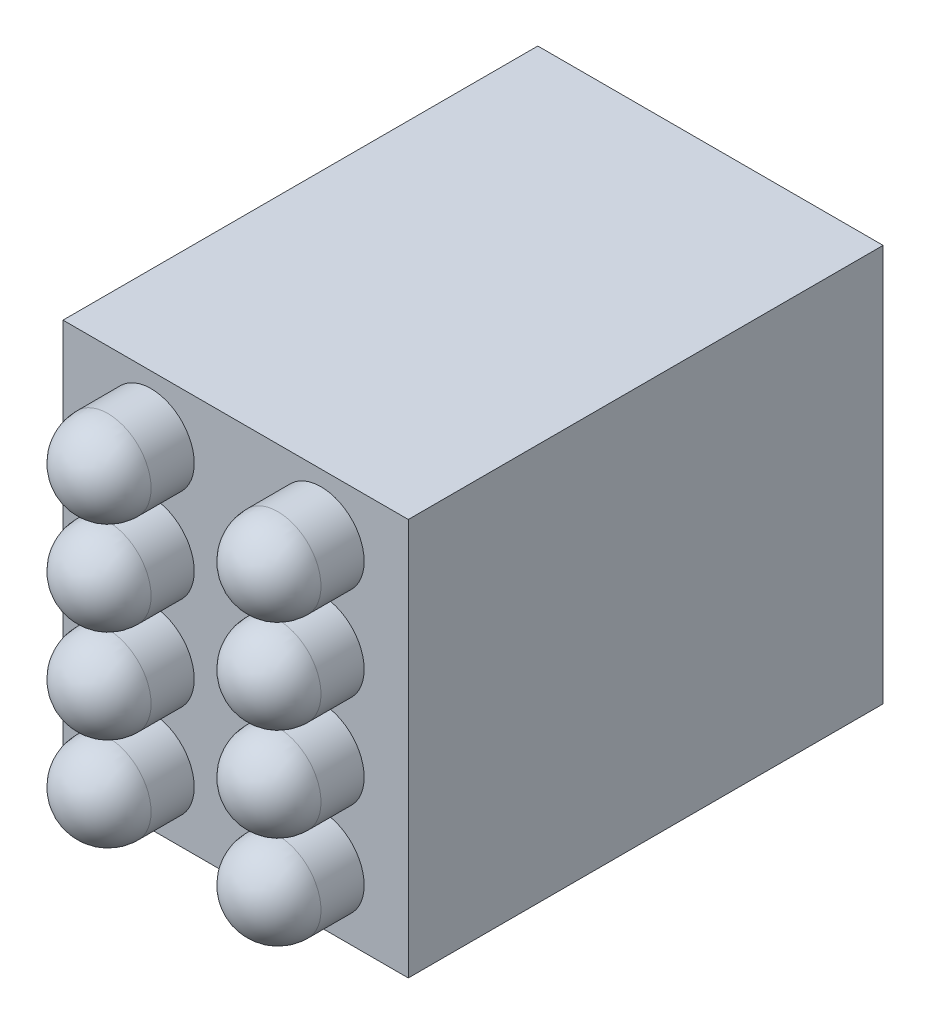
ISO-10303-21;
HEADER;
FILE_DESCRIPTION(('STEP AP214'),'2;1');
FILE_NAME('part.step','',(''),(''),'','','');
FILE_SCHEMA(('AUTOMOTIVE_DESIGN { 1 0 10303 214 1 1 1 1 }'));
ENDSEC;
DATA;
#1=APPLICATION_CONTEXT('core data for automotive mechanical design processes');
#2=APPLICATION_PROTOCOL_DEFINITION('international standard','automotive_design',2000,#1);
#3=PRODUCT_CONTEXT('',#1,'mechanical');
#4=PRODUCT('Part','Part','',(#3));
#5=PRODUCT_RELATED_PRODUCT_CATEGORY('part','',(#4));
#6=PRODUCT_DEFINITION_FORMATION('','',#4);
#7=PRODUCT_DEFINITION_CONTEXT('part definition',#1,'design');
#8=PRODUCT_DEFINITION('design','',#6,#7);
#9=PRODUCT_DEFINITION_SHAPE('','',#8);
#10=(LENGTH_UNIT() NAMED_UNIT(*) SI_UNIT(.MILLI.,.METRE.));
#11=(NAMED_UNIT(*) PLANE_ANGLE_UNIT() SI_UNIT($,.RADIAN.));
#12=(NAMED_UNIT(*) SI_UNIT($,.STERADIAN.) SOLID_ANGLE_UNIT());
#13=UNCERTAINTY_MEASURE_WITH_UNIT(LENGTH_MEASURE(1.E-05),#10,'distance_accuracy_value','');
#14=(GEOMETRIC_REPRESENTATION_CONTEXT(3) GLOBAL_UNCERTAINTY_ASSIGNED_CONTEXT((#13)) GLOBAL_UNIT_ASSIGNED_CONTEXT((#10,
#11,#12)) REPRESENTATION_CONTEXT('',''));
#15=CARTESIAN_POINT('',(0.,0.,0.));
#16=DIRECTION('',(0.,0.,1.));
#17=DIRECTION('',(1.,0.,0.));
#18=AXIS2_PLACEMENT_3D('',#15,#16,#17);
#19=CARTESIAN_POINT('',(2.51079999999999,4.1225,8.255));
#20=DIRECTION('',(1.,0.,0.));
#21=DIRECTION('',(0.,1.,0.));
#22=AXIS2_PLACEMENT_3D('',#19,#20,#21);
#23=SPHERICAL_SURFACE('',#22,1.27);
#24=CARTESIAN_POINT('',(2.51079999999999,4.1225,8.255));
#25=DIRECTION('',(0.,0.,1.));
#26=DIRECTION('',(1.,0.,0.));
#27=AXIS2_PLACEMENT_3D('',#24,#25,#26);
#28=CIRCLE('',#27,1.27);
#29=CARTESIAN_POINT('',(1.24079999999999,4.12249999999999,8.255));
#30=VERTEX_POINT('',#29);
#31=CARTESIAN_POINT('',(3.78079999999999,4.12249999999999,8.255));
#32=VERTEX_POINT('',#31);
#33=EDGE_CURVE('E109',#30,#32,#28,.F.);
#34=ORIENTED_EDGE('',*,*,#33,.F.);
#35=CARTESIAN_POINT('',(2.51079999999999,4.1225,8.255));
#36=DIRECTION('',(0.,0.,1.));
#37=DIRECTION('',(1.,0.,0.));
#38=AXIS2_PLACEMENT_3D('',#35,#36,#37);
#39=CIRCLE('',#38,1.27);
#40=EDGE_CURVE('E104',#32,#30,#39,.F.);
#41=ORIENTED_EDGE('',*,*,#40,.F.);
#42=EDGE_LOOP('',(#34,#41));
#43=FACE_BOUND('',#42,.T.);
#44=ADVANCED_FACE('F17',(#43),#23,.T.);
#45=CARTESIAN_POINT('',(2.51079999999999,1.3725,8.255));
#46=DIRECTION('',(1.,0.,0.));
#47=DIRECTION('',(0.,1.,0.));
#48=AXIS2_PLACEMENT_3D('',#45,#46,#47);
#49=SPHERICAL_SURFACE('',#48,1.27);
#50=CARTESIAN_POINT('',(2.51079999999999,1.3725,8.255));
#51=DIRECTION('',(0.,0.,1.));
#52=DIRECTION('',(1.,0.,0.));
#53=AXIS2_PLACEMENT_3D('',#50,#51,#52);
#54=CIRCLE('',#53,1.27);
#55=CARTESIAN_POINT('',(1.24079999999999,1.3725,8.255));
#56=VERTEX_POINT('',#55);
#57=CARTESIAN_POINT('',(3.78079999999999,1.3725,8.255));
#58=VERTEX_POINT('',#57);
#59=EDGE_CURVE('E113',#56,#58,#54,.F.);
#60=ORIENTED_EDGE('',*,*,#59,.F.);
#61=CARTESIAN_POINT('',(2.51079999999999,1.3725,8.255));
#62=DIRECTION('',(0.,0.,1.));
#63=DIRECTION('',(1.,0.,0.));
#64=AXIS2_PLACEMENT_3D('',#61,#62,#63);
#65=CIRCLE('',#64,1.27);
#66=EDGE_CURVE('E111',#58,#56,#65,.F.);
#67=ORIENTED_EDGE('',*,*,#66,.F.);
#68=EDGE_LOOP('',(#60,#67));
#69=FACE_BOUND('',#68,.T.);
#70=ADVANCED_FACE('F245',(#69),#49,.T.);
#71=CARTESIAN_POINT('',(2.51079999999999,-1.3775,8.255));
#72=DIRECTION('',(1.,0.,0.));
#73=DIRECTION('',(0.,1.,0.));
#74=AXIS2_PLACEMENT_3D('',#71,#72,#73);
#75=SPHERICAL_SURFACE('',#74,1.27);
#76=CARTESIAN_POINT('',(2.51079999999999,-1.3775,8.255));
#77=DIRECTION('',(0.,0.,1.));
#78=DIRECTION('',(1.,0.,0.));
#79=AXIS2_PLACEMENT_3D('',#76,#77,#78);
#80=CIRCLE('',#79,1.27);
#81=CARTESIAN_POINT('',(1.24079999999999,-1.3775,8.255));
#82=VERTEX_POINT('',#81);
#83=CARTESIAN_POINT('',(3.78079999999999,-1.3775,8.255));
#84=VERTEX_POINT('',#83);
#85=EDGE_CURVE('E230',#82,#84,#80,.F.);
#86=ORIENTED_EDGE('',*,*,#85,.F.);
#87=CARTESIAN_POINT('',(2.51079999999999,-1.3775,8.255));
#88=DIRECTION('',(0.,0.,1.));
#89=DIRECTION('',(1.,0.,0.));
#90=AXIS2_PLACEMENT_3D('',#87,#88,#89);
#91=CIRCLE('',#90,1.27);
#92=EDGE_CURVE('E228',#84,#82,#91,.F.);
#93=ORIENTED_EDGE('',*,*,#92,.F.);
#94=EDGE_LOOP('',(#86,#93));
#95=FACE_BOUND('',#94,.T.);
#96=ADVANCED_FACE('F220',(#95),#75,.T.);
#97=CARTESIAN_POINT('',(2.51079999999999,-4.1275,8.255));
#98=DIRECTION('',(1.,0.,0.));
#99=DIRECTION('',(0.,1.,0.));
#100=AXIS2_PLACEMENT_3D('',#97,#98,#99);
#101=SPHERICAL_SURFACE('',#100,1.27);
#102=CARTESIAN_POINT('',(2.51079999999999,-4.1275,8.255));
#103=DIRECTION('',(0.,0.,1.));
#104=DIRECTION('',(1.,0.,0.));
#105=AXIS2_PLACEMENT_3D('',#102,#103,#104);
#106=CIRCLE('',#105,1.27);
#107=CARTESIAN_POINT('',(1.24079999999999,-4.1275,8.255));
#108=VERTEX_POINT('',#107);
#109=CARTESIAN_POINT('',(3.78079999999999,-4.1275,8.255));
#110=VERTEX_POINT('',#109);
#111=EDGE_CURVE('E201',#108,#110,#106,.F.);
#112=ORIENTED_EDGE('',*,*,#111,.F.);
#113=CARTESIAN_POINT('',(2.51079999999999,-4.1275,8.255));
#114=DIRECTION('',(0.,0.,1.));
#115=DIRECTION('',(1.,0.,0.));
#116=AXIS2_PLACEMENT_3D('',#113,#114,#115);
#117=CIRCLE('',#116,1.27);
#118=EDGE_CURVE('E210',#110,#108,#117,.F.);
#119=ORIENTED_EDGE('',*,*,#118,.F.);
#120=EDGE_LOOP('',(#112,#119));
#121=FACE_BOUND('',#120,.T.);
#122=ADVANCED_FACE('F215',(#121),#101,.T.);
#123=CARTESIAN_POINT('',(-2.4892,4.1225,8.255));
#124=DIRECTION('',(1.,0.,0.));
#125=DIRECTION('',(0.,1.,0.));
#126=AXIS2_PLACEMENT_3D('',#123,#124,#125);
#127=SPHERICAL_SURFACE('',#126,1.27);
#128=CARTESIAN_POINT('',(-2.4892,4.1225,8.255));
#129=DIRECTION('',(0.,0.,1.));
#130=DIRECTION('',(1.,0.,0.));
#131=AXIS2_PLACEMENT_3D('',#128,#129,#130);
#132=CIRCLE('',#131,1.27);
#133=CARTESIAN_POINT('',(-3.7592,4.12249999999999,8.255));
#134=VERTEX_POINT('',#133);
#135=CARTESIAN_POINT('',(-1.2192,4.12249999999999,8.255));
#136=VERTEX_POINT('',#135);
#137=EDGE_CURVE('E191',#134,#136,#132,.F.);
#138=ORIENTED_EDGE('',*,*,#137,.F.);
#139=CARTESIAN_POINT('',(-2.4892,4.1225,8.255));
#140=DIRECTION('',(0.,0.,1.));
#141=DIRECTION('',(1.,0.,0.));
#142=AXIS2_PLACEMENT_3D('',#139,#140,#141);
#143=CIRCLE('',#142,1.27);
#144=EDGE_CURVE('E199',#136,#134,#143,.F.);
#145=ORIENTED_EDGE('',*,*,#144,.F.);
#146=EDGE_LOOP('',(#138,#145));
#147=FACE_BOUND('',#146,.T.);
#148=ADVANCED_FACE('F212',(#147),#127,.T.);
#149=CARTESIAN_POINT('',(-2.4892,1.3725,8.255));
#150=DIRECTION('',(1.,0.,0.));
#151=DIRECTION('',(0.,1.,0.));
#152=AXIS2_PLACEMENT_3D('',#149,#150,#151);
#153=SPHERICAL_SURFACE('',#152,1.27);
#154=CARTESIAN_POINT('',(-2.4892,1.3725,8.255));
#155=DIRECTION('',(0.,0.,1.));
#156=DIRECTION('',(1.,0.,0.));
#157=AXIS2_PLACEMENT_3D('',#154,#155,#156);
#158=CIRCLE('',#157,1.27);
#159=CARTESIAN_POINT('',(-3.7592,1.3725,8.255));
#160=VERTEX_POINT('',#159);
#161=CARTESIAN_POINT('',(-1.2192,1.3725,8.255));
#162=VERTEX_POINT('',#161);
#163=EDGE_CURVE('E190',#160,#162,#158,.F.);
#164=ORIENTED_EDGE('',*,*,#163,.F.);
#165=CARTESIAN_POINT('',(-2.4892,1.3725,8.255));
#166=DIRECTION('',(0.,0.,1.));
#167=DIRECTION('',(1.,0.,0.));
#168=AXIS2_PLACEMENT_3D('',#165,#166,#167);
#169=CIRCLE('',#168,1.27);
#170=EDGE_CURVE('E188',#162,#160,#169,.F.);
#171=ORIENTED_EDGE('',*,*,#170,.F.);
#172=EDGE_LOOP('',(#164,#171));
#173=FACE_BOUND('',#172,.T.);
#174=ADVANCED_FACE('F179',(#173),#153,.T.);
#175=CARTESIAN_POINT('',(-2.4892,-1.3775,8.255));
#176=DIRECTION('',(1.,0.,0.));
#177=DIRECTION('',(0.,1.,0.));
#178=AXIS2_PLACEMENT_3D('',#175,#176,#177);
#179=SPHERICAL_SURFACE('',#178,1.27);
#180=CARTESIAN_POINT('',(-2.4892,-1.3775,8.255));
#181=DIRECTION('',(0.,0.,1.));
#182=DIRECTION('',(1.,0.,0.));
#183=AXIS2_PLACEMENT_3D('',#180,#181,#182);
#184=CIRCLE('',#183,1.27);
#185=CARTESIAN_POINT('',(-3.7592,-1.3775,8.255));
#186=VERTEX_POINT('',#185);
#187=CARTESIAN_POINT('',(-1.2192,-1.3775,8.255));
#188=VERTEX_POINT('',#187);
#189=EDGE_CURVE('E159',#186,#188,#184,.F.);
#190=ORIENTED_EDGE('',*,*,#189,.F.);
#191=CARTESIAN_POINT('',(-2.4892,-1.3775,8.255));
#192=DIRECTION('',(0.,0.,1.));
#193=DIRECTION('',(1.,0.,0.));
#194=AXIS2_PLACEMENT_3D('',#191,#192,#193);
#195=CIRCLE('',#194,1.27);
#196=EDGE_CURVE('E166',#188,#186,#195,.F.);
#197=ORIENTED_EDGE('',*,*,#196,.F.);
#198=EDGE_LOOP('',(#190,#197));
#199=FACE_BOUND('',#198,.T.);
#200=ADVANCED_FACE('F173',(#199),#179,.T.);
#201=CARTESIAN_POINT('',(-2.4892,-4.1275,8.255));
#202=DIRECTION('',(1.,0.,0.));
#203=DIRECTION('',(0.,1.,0.));
#204=AXIS2_PLACEMENT_3D('',#201,#202,#203);
#205=SPHERICAL_SURFACE('',#204,1.27);
#206=CARTESIAN_POINT('',(-2.4892,-4.1275,8.255));
#207=DIRECTION('',(0.,0.,1.));
#208=DIRECTION('',(1.,0.,0.));
#209=AXIS2_PLACEMENT_3D('',#206,#207,#208);
#210=CIRCLE('',#209,1.27);
#211=CARTESIAN_POINT('',(-3.7592,-4.1275,8.255));
#212=VERTEX_POINT('',#211);
#213=CARTESIAN_POINT('',(-1.2192,-4.1275,8.255));
#214=VERTEX_POINT('',#213);
#215=EDGE_CURVE('E147',#212,#214,#210,.F.);
#216=ORIENTED_EDGE('',*,*,#215,.F.);
#217=CARTESIAN_POINT('',(-2.4892,-4.1275,8.255));
#218=DIRECTION('',(0.,0.,1.));
#219=DIRECTION('',(1.,0.,0.));
#220=AXIS2_PLACEMENT_3D('',#217,#218,#219);
#221=CIRCLE('',#220,1.27);
#222=EDGE_CURVE('E153',#214,#212,#221,.F.);
#223=ORIENTED_EDGE('',*,*,#222,.F.);
#224=EDGE_LOOP('',(#216,#223));
#225=FACE_BOUND('',#224,.T.);
#226=ADVANCED_FACE('F169',(#225),#205,.T.);
#227=CARTESIAN_POINT('',(2.51079999999999,4.1225,6.985));
#228=DIRECTION('',(0.,0.,1.));
#229=DIRECTION('',(1.,0.,0.));
#230=AXIS2_PLACEMENT_3D('',#227,#228,#229);
#231=CYLINDRICAL_SURFACE('',#230,1.27);
#232=ORIENTED_EDGE('',*,*,#40,.T.);
#233=ORIENTED_EDGE('',*,*,#33,.T.);
#234=EDGE_LOOP('',(#232,#233));
#235=FACE_BOUND('',#234,.T.);
#236=CARTESIAN_POINT('',(2.51079999999999,4.1225,6.985));
#237=DIRECTION('',(0.,0.,1.));
#238=DIRECTION('',(1.,0.,0.));
#239=AXIS2_PLACEMENT_3D('',#236,#237,#238);
#240=CIRCLE('',#239,1.27);
#241=CARTESIAN_POINT('',(3.78079999999999,4.1225,6.985));
#242=VERTEX_POINT('',#241);
#243=EDGE_CURVE('E21',#242,#242,#240,.F.);
#244=ORIENTED_EDGE('',*,*,#243,.F.);
#245=EDGE_LOOP('',(#244));
#246=FACE_BOUND('',#245,.T.);
#247=ADVANCED_FACE('F107',(#235,#246),#231,.T.);
#248=CARTESIAN_POINT('',(2.51079999999999,1.3725,6.985));
#249=DIRECTION('',(0.,0.,1.));
#250=DIRECTION('',(1.,0.,0.));
#251=AXIS2_PLACEMENT_3D('',#248,#249,#250);
#252=CYLINDRICAL_SURFACE('',#251,1.27);
#253=ORIENTED_EDGE('',*,*,#66,.T.);
#254=ORIENTED_EDGE('',*,*,#59,.T.);
#255=EDGE_LOOP('',(#253,#254));
#256=FACE_BOUND('',#255,.T.);
#257=CARTESIAN_POINT('',(2.51079999999999,1.3725,6.985));
#258=DIRECTION('',(0.,0.,1.));
#259=DIRECTION('',(1.,0.,0.));
#260=AXIS2_PLACEMENT_3D('',#257,#258,#259);
#261=CIRCLE('',#260,1.27);
#262=CARTESIAN_POINT('',(3.78079999999999,1.3725,6.985));
#263=VERTEX_POINT('',#262);
#264=EDGE_CURVE('E139',#263,#263,#261,.F.);
#265=ORIENTED_EDGE('',*,*,#264,.F.);
#266=EDGE_LOOP('',(#265));
#267=FACE_BOUND('',#266,.T.);
#268=ADVANCED_FACE('F304',(#256,#267),#252,.T.);
#269=CARTESIAN_POINT('',(2.51079999999999,-1.3775,6.985));
#270=DIRECTION('',(0.,0.,1.));
#271=DIRECTION('',(1.,0.,0.));
#272=AXIS2_PLACEMENT_3D('',#269,#270,#271);
#273=CYLINDRICAL_SURFACE('',#272,1.27);
#274=ORIENTED_EDGE('',*,*,#92,.T.);
#275=ORIENTED_EDGE('',*,*,#85,.T.);
#276=EDGE_LOOP('',(#274,#275));
#277=FACE_BOUND('',#276,.T.);
#278=CARTESIAN_POINT('',(2.51079999999999,-1.3775,6.985));
#279=DIRECTION('',(0.,0.,1.));
#280=DIRECTION('',(1.,0.,0.));
#281=AXIS2_PLACEMENT_3D('',#278,#279,#280);
#282=CIRCLE('',#281,1.27);
#283=CARTESIAN_POINT('',(3.78079999999999,-1.3775,6.985));
#284=VERTEX_POINT('',#283);
#285=EDGE_CURVE('E137',#284,#284,#282,.F.);
#286=ORIENTED_EDGE('',*,*,#285,.F.);
#287=EDGE_LOOP('',(#286));
#288=FACE_BOUND('',#287,.T.);
#289=ADVANCED_FACE('F301',(#277,#288),#273,.T.);
#290=CARTESIAN_POINT('',(2.51079999999999,-4.1275,6.985));
#291=DIRECTION('',(0.,0.,1.));
#292=DIRECTION('',(1.,0.,0.));
#293=AXIS2_PLACEMENT_3D('',#290,#291,#292);
#294=CYLINDRICAL_SURFACE('',#293,1.27);
#295=ORIENTED_EDGE('',*,*,#118,.T.);
#296=ORIENTED_EDGE('',*,*,#111,.T.);
#297=EDGE_LOOP('',(#295,#296));
#298=FACE_BOUND('',#297,.T.);
#299=CARTESIAN_POINT('',(2.51079999999999,-4.1275,6.985));
#300=DIRECTION('',(0.,0.,1.));
#301=DIRECTION('',(1.,0.,0.));
#302=AXIS2_PLACEMENT_3D('',#299,#300,#301);
#303=CIRCLE('',#302,1.27);
#304=CARTESIAN_POINT('',(3.78079999999999,-4.1275,6.985));
#305=VERTEX_POINT('',#304);
#306=EDGE_CURVE('E134',#305,#305,#303,.F.);
#307=ORIENTED_EDGE('',*,*,#306,.F.);
#308=EDGE_LOOP('',(#307));
#309=FACE_BOUND('',#308,.T.);
#310=ADVANCED_FACE('F297',(#298,#309),#294,.T.);
#311=CARTESIAN_POINT('',(-2.4892,4.1225,6.985));
#312=DIRECTION('',(0.,0.,1.));
#313=DIRECTION('',(1.,0.,0.));
#314=AXIS2_PLACEMENT_3D('',#311,#312,#313);
#315=CYLINDRICAL_SURFACE('',#314,1.27);
#316=ORIENTED_EDGE('',*,*,#144,.T.);
#317=ORIENTED_EDGE('',*,*,#137,.T.);
#318=EDGE_LOOP('',(#316,#317));
#319=FACE_BOUND('',#318,.T.);
#320=CARTESIAN_POINT('',(-2.4892,4.1225,6.985));
#321=DIRECTION('',(0.,0.,1.));
#322=DIRECTION('',(1.,0.,0.));
#323=AXIS2_PLACEMENT_3D('',#320,#321,#322);
#324=CIRCLE('',#323,1.27);
#325=CARTESIAN_POINT('',(-1.2192,4.1225,6.985));
#326=VERTEX_POINT('',#325);
#327=EDGE_CURVE('E131',#326,#326,#324,.F.);
#328=ORIENTED_EDGE('',*,*,#327,.F.);
#329=EDGE_LOOP('',(#328));
#330=FACE_BOUND('',#329,.T.);
#331=ADVANCED_FACE('F293',(#319,#330),#315,.T.);
#332=CARTESIAN_POINT('',(-2.4892,1.3725,6.985));
#333=DIRECTION('',(0.,0.,1.));
#334=DIRECTION('',(1.,0.,0.));
#335=AXIS2_PLACEMENT_3D('',#332,#333,#334);
#336=CYLINDRICAL_SURFACE('',#335,1.27);
#337=ORIENTED_EDGE('',*,*,#170,.T.);
#338=ORIENTED_EDGE('',*,*,#163,.T.);
#339=EDGE_LOOP('',(#337,#338));
#340=FACE_BOUND('',#339,.T.);
#341=CARTESIAN_POINT('',(-2.4892,1.3725,6.985));
#342=DIRECTION('',(0.,0.,1.));
#343=DIRECTION('',(1.,0.,0.));
#344=AXIS2_PLACEMENT_3D('',#341,#342,#343);
#345=CIRCLE('',#344,1.27);
#346=CARTESIAN_POINT('',(-1.2192,1.3725,6.985));
#347=VERTEX_POINT('',#346);
#348=EDGE_CURVE('E128',#347,#347,#345,.F.);
#349=ORIENTED_EDGE('',*,*,#348,.F.);
#350=EDGE_LOOP('',(#349));
#351=FACE_BOUND('',#350,.T.);
#352=ADVANCED_FACE('F289',(#340,#351),#336,.T.);
#353=CARTESIAN_POINT('',(-2.4892,-1.3775,6.985));
#354=DIRECTION('',(0.,0.,1.));
#355=DIRECTION('',(1.,0.,0.));
#356=AXIS2_PLACEMENT_3D('',#353,#354,#355);
#357=CYLINDRICAL_SURFACE('',#356,1.27);
#358=ORIENTED_EDGE('',*,*,#196,.T.);
#359=ORIENTED_EDGE('',*,*,#189,.T.);
#360=EDGE_LOOP('',(#358,#359));
#361=FACE_BOUND('',#360,.T.);
#362=CARTESIAN_POINT('',(-2.4892,-1.3775,6.985));
#363=DIRECTION('',(0.,0.,1.));
#364=DIRECTION('',(1.,0.,0.));
#365=AXIS2_PLACEMENT_3D('',#362,#363,#364);
#366=CIRCLE('',#365,1.27);
#367=CARTESIAN_POINT('',(-1.2192,-1.3775,6.985));
#368=VERTEX_POINT('',#367);
#369=EDGE_CURVE('E125',#368,#368,#366,.F.);
#370=ORIENTED_EDGE('',*,*,#369,.F.);
#371=EDGE_LOOP('',(#370));
#372=FACE_BOUND('',#371,.T.);
#373=ADVANCED_FACE('F285',(#361,#372),#357,.T.);
#374=CARTESIAN_POINT('',(-2.4892,-4.1275,6.985));
#375=DIRECTION('',(0.,0.,1.));
#376=DIRECTION('',(1.,0.,0.));
#377=AXIS2_PLACEMENT_3D('',#374,#375,#376);
#378=CYLINDRICAL_SURFACE('',#377,1.27);
#379=ORIENTED_EDGE('',*,*,#222,.T.);
#380=ORIENTED_EDGE('',*,*,#215,.T.);
#381=EDGE_LOOP('',(#379,#380));
#382=FACE_BOUND('',#381,.T.);
#383=CARTESIAN_POINT('',(-2.4892,-4.1275,6.985));
#384=DIRECTION('',(0.,0.,1.));
#385=DIRECTION('',(1.,0.,0.));
#386=AXIS2_PLACEMENT_3D('',#383,#384,#385);
#387=CIRCLE('',#386,1.27);
#388=CARTESIAN_POINT('',(-1.2192,-4.1275,6.985));
#389=VERTEX_POINT('',#388);
#390=EDGE_CURVE('E121',#389,#389,#387,.F.);
#391=ORIENTED_EDGE('',*,*,#390,.F.);
#392=EDGE_LOOP('',(#391));
#393=FACE_BOUND('',#392,.T.);
#394=ADVANCED_FACE('F281',(#382,#393),#378,.T.);
#395=CARTESIAN_POINT('',(-5.08,-5.842,0.));
#396=DIRECTION('',(-1.,0.,0.));
#397=DIRECTION('',(0.,0.,1.));
#398=AXIS2_PLACEMENT_3D('',#395,#396,#397);
#399=PLANE('',#398);
#400=DIRECTION('',(0.,1.,0.));
#401=VECTOR('',#400,1.);
#402=CARTESIAN_POINT('',(-5.08,0.,-6.985));
#403=LINE('',#402,#401);
#404=CARTESIAN_POINT('',(-5.08,5.842,-6.985));
#405=VERTEX_POINT('',#404);
#406=CARTESIAN_POINT('',(-5.08,-5.842,-6.985));
#407=VERTEX_POINT('',#406);
#408=EDGE_CURVE('E430',#405,#407,#403,.F.);
#409=ORIENTED_EDGE('',*,*,#408,.T.);
#410=DIRECTION('',(0.,0.,-1.));
#411=VECTOR('',#410,1.);
#412=CARTESIAN_POINT('',(-5.08,-5.842,0.));
#413=LINE('',#412,#411);
#414=CARTESIAN_POINT('',(-5.08,-5.842,6.985));
#415=VERTEX_POINT('',#414);
#416=EDGE_CURVE('E432',#415,#407,#413,.T.);
#417=ORIENTED_EDGE('',*,*,#416,.F.);
#418=DIRECTION('',(0.,1.,0.));
#419=VECTOR('',#418,1.);
#420=CARTESIAN_POINT('',(-5.08,0.,6.985));
#421=LINE('',#420,#419);
#422=CARTESIAN_POINT('',(-5.08,5.842,6.985));
#423=VERTEX_POINT('',#422);
#424=EDGE_CURVE('E144',#423,#415,#421,.F.);
#425=ORIENTED_EDGE('',*,*,#424,.F.);
#426=DIRECTION('',(0.,0.,1.));
#427=VECTOR('',#426,1.);
#428=CARTESIAN_POINT('',(-5.08,5.842,0.));
#429=LINE('',#428,#427);
#430=EDGE_CURVE('E435',#405,#423,#429,.T.);
#431=ORIENTED_EDGE('',*,*,#430,.F.);
#432=EDGE_LOOP('',(#409,#417,#425,#431));
#433=FACE_BOUND('',#432,.T.);
#434=ADVANCED_FACE('F277',(#433),#399,.T.);
#435=CARTESIAN_POINT('',(0.,0.,6.985));
#436=DIRECTION('',(0.,0.,1.));
#437=DIRECTION('',(1.,0.,0.));
#438=AXIS2_PLACEMENT_3D('',#435,#436,#437);
#439=PLANE('',#438);
#440=ORIENTED_EDGE('',*,*,#390,.T.);
#441=EDGE_LOOP('',(#440));
#442=FACE_BOUND('',#441,.T.);
#443=ORIENTED_EDGE('',*,*,#369,.T.);
#444=EDGE_LOOP('',(#443));
#445=FACE_BOUND('',#444,.T.);
#446=ORIENTED_EDGE('',*,*,#348,.T.);
#447=EDGE_LOOP('',(#446));
#448=FACE_BOUND('',#447,.T.);
#449=ORIENTED_EDGE('',*,*,#327,.T.);
#450=EDGE_LOOP('',(#449));
#451=FACE_BOUND('',#450,.T.);
#452=ORIENTED_EDGE('',*,*,#306,.T.);
#453=EDGE_LOOP('',(#452));
#454=FACE_BOUND('',#453,.T.);
#455=ORIENTED_EDGE('',*,*,#285,.T.);
#456=EDGE_LOOP('',(#455));
#457=FACE_BOUND('',#456,.T.);
#458=ORIENTED_EDGE('',*,*,#264,.T.);
#459=EDGE_LOOP('',(#458));
#460=FACE_BOUND('',#459,.T.);
#461=ORIENTED_EDGE('',*,*,#243,.T.);
#462=EDGE_LOOP('',(#461));
#463=FACE_BOUND('',#462,.T.);
#464=ORIENTED_EDGE('',*,*,#424,.T.);
#465=DIRECTION('',(1.,0.,0.));
#466=VECTOR('',#465,1.);
#467=CARTESIAN_POINT('',(5.08,-5.842,6.985));
#468=LINE('',#467,#466);
#469=CARTESIAN_POINT('',(5.08,-5.842,6.985));
#470=VERTEX_POINT('',#469);
#471=EDGE_CURVE('E124',#470,#415,#468,.F.);
#472=ORIENTED_EDGE('',*,*,#471,.F.);
#473=DIRECTION('',(0.,1.,0.));
#474=VECTOR('',#473,1.);
#475=CARTESIAN_POINT('',(5.08,5.842,6.985));
#476=LINE('',#475,#474);
#477=CARTESIAN_POINT('',(5.08,5.842,6.985));
#478=VERTEX_POINT('',#477);
#479=EDGE_CURVE('E447',#478,#470,#476,.F.);
#480=ORIENTED_EDGE('',*,*,#479,.F.);
#481=DIRECTION('',(1.,0.,0.));
#482=VECTOR('',#481,1.);
#483=CARTESIAN_POINT('',(-5.08,5.842,6.985));
#484=LINE('',#483,#482);
#485=EDGE_CURVE('E436',#423,#478,#484,.T.);
#486=ORIENTED_EDGE('',*,*,#485,.F.);
#487=EDGE_LOOP('',(#464,#472,#480,#486));
#488=FACE_BOUND('',#487,.T.);
#489=ADVANCED_FACE('F273',(#442,#445,#448,#451,#454,#457,#460,#463,#488),#439,.T.);
#490=CARTESIAN_POINT('',(5.08,-5.842,0.));
#491=DIRECTION('',(0.,-1.,0.));
#492=DIRECTION('',(0.,0.,-1.));
#493=AXIS2_PLACEMENT_3D('',#490,#491,#492);
#494=PLANE('',#493);
#495=DIRECTION('',(1.,0.,0.));
#496=VECTOR('',#495,1.);
#497=CARTESIAN_POINT('',(0.,-5.842,-6.985));
#498=LINE('',#497,#496);
#499=CARTESIAN_POINT('',(5.08,-5.842,-6.985));
#500=VERTEX_POINT('',#499);
#501=EDGE_CURVE('E437',#407,#500,#498,.T.);
#502=ORIENTED_EDGE('',*,*,#501,.T.);
#503=DIRECTION('',(0.,0.,-1.));
#504=VECTOR('',#503,1.);
#505=CARTESIAN_POINT('',(5.08,-5.842,0.));
#506=LINE('',#505,#504);
#507=EDGE_CURVE('E450',#470,#500,#506,.T.);
#508=ORIENTED_EDGE('',*,*,#507,.F.);
#509=ORIENTED_EDGE('',*,*,#471,.T.);
#510=ORIENTED_EDGE('',*,*,#416,.T.);
#511=EDGE_LOOP('',(#502,#508,#509,#510));
#512=FACE_BOUND('',#511,.T.);
#513=ADVANCED_FACE('F270',(#512),#494,.T.);
#514=CARTESIAN_POINT('',(0.,0.,-6.985));
#515=DIRECTION('',(0.,0.,1.));
#516=DIRECTION('',(1.,0.,0.));
#517=AXIS2_PLACEMENT_3D('',#514,#515,#516);
#518=PLANE('',#517);
#519=DIRECTION('',(1.,0.,0.));
#520=VECTOR('',#519,1.);
#521=CARTESIAN_POINT('',(-5.08,5.842,-6.985));
#522=LINE('',#521,#520);
#523=CARTESIAN_POINT('',(5.08,5.842,-6.985));
#524=VERTEX_POINT('',#523);
#525=EDGE_CURVE('E36',#524,#405,#522,.F.);
#526=ORIENTED_EDGE('',*,*,#525,.F.);
#527=DIRECTION('',(0.,1.,0.));
#528=VECTOR('',#527,1.);
#529=CARTESIAN_POINT('',(5.08,5.842,-6.985));
#530=LINE('',#529,#528);
#531=EDGE_CURVE('E27',#500,#524,#530,.T.);
#532=ORIENTED_EDGE('',*,*,#531,.F.);
#533=ORIENTED_EDGE('',*,*,#501,.F.);
#534=ORIENTED_EDGE('',*,*,#408,.F.);
#535=EDGE_LOOP('',(#526,#532,#533,#534));
#536=FACE_BOUND('',#535,.T.);
#537=ADVANCED_FACE('F263',(#536),#518,.F.);
#538=CARTESIAN_POINT('',(-5.08,5.842,0.));
#539=DIRECTION('',(0.,1.,0.));
#540=DIRECTION('',(0.,0.,1.));
#541=AXIS2_PLACEMENT_3D('',#538,#539,#540);
#542=PLANE('',#541);
#543=ORIENTED_EDGE('',*,*,#525,.T.);
#544=ORIENTED_EDGE('',*,*,#430,.T.);
#545=ORIENTED_EDGE('',*,*,#485,.T.);
#546=DIRECTION('',(0.,0.,-1.));
#547=VECTOR('',#546,1.);
#548=CARTESIAN_POINT('',(5.08,5.842,0.));
#549=LINE('',#548,#547);
#550=EDGE_CURVE('E11',#524,#478,#549,.F.);
#551=ORIENTED_EDGE('',*,*,#550,.F.);
#552=EDGE_LOOP('',(#543,#544,#545,#551));
#553=FACE_BOUND('',#552,.T.);
#554=ADVANCED_FACE('F257',(#553),#542,.T.);
#555=CARTESIAN_POINT('',(5.08,5.842,0.));
#556=DIRECTION('',(1.,0.,0.));
#557=DIRECTION('',(0.,0.,-1.));
#558=AXIS2_PLACEMENT_3D('',#555,#556,#557);
#559=PLANE('',#558);
#560=ORIENTED_EDGE('',*,*,#531,.T.);
#561=ORIENTED_EDGE('',*,*,#550,.T.);
#562=ORIENTED_EDGE('',*,*,#479,.T.);
#563=ORIENTED_EDGE('',*,*,#507,.T.);
#564=EDGE_LOOP('',(#560,#561,#562,#563));
#565=FACE_BOUND('',#564,.T.);
#566=ADVANCED_FACE('F255',(#565),#559,.T.);
#567=CLOSED_SHELL('',(#44,#70,#96,#122,#148,#174,#200,#226,#247,#268,#289,#310,#331,#352,#373,
#394,#434,#489,#513,#537,#554,#566));
#568=MANIFOLD_SOLID_BREP('B1',#567);
#569=ADVANCED_BREP_SHAPE_REPRESENTATION('',(#18,#568),#14);
#570=SHAPE_DEFINITION_REPRESENTATION(#9,#569);
ENDSEC;
END-ISO-10303-21;
